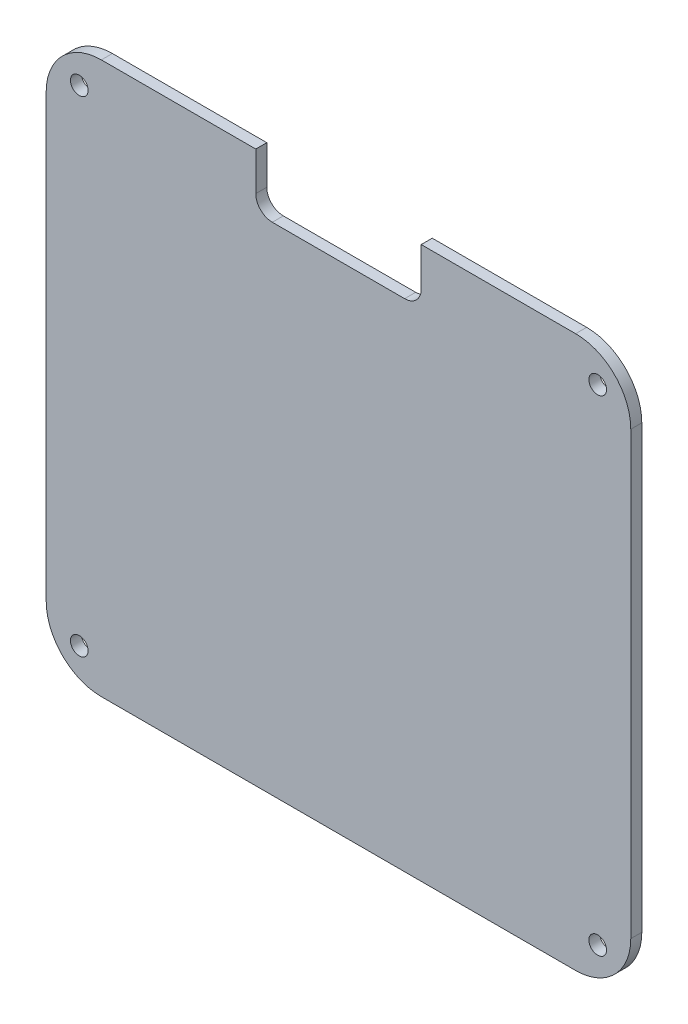
ISO-10303-21;
HEADER;
FILE_DESCRIPTION(('STEP AP214'),'2;1');
FILE_NAME('part.step','',(''),(''),'','','');
FILE_SCHEMA(('AUTOMOTIVE_DESIGN { 1 0 10303 214 1 1 1 1 }'));
ENDSEC;
DATA;
#1=APPLICATION_CONTEXT('core data for automotive mechanical design processes');
#2=APPLICATION_PROTOCOL_DEFINITION('international standard','automotive_design',2000,#1);
#3=PRODUCT_CONTEXT('',#1,'mechanical');
#4=PRODUCT('Part','Part','',(#3));
#5=PRODUCT_RELATED_PRODUCT_CATEGORY('part','',(#4));
#6=PRODUCT_DEFINITION_FORMATION('','',#4);
#7=PRODUCT_DEFINITION_CONTEXT('part definition',#1,'design');
#8=PRODUCT_DEFINITION('design','',#6,#7);
#9=PRODUCT_DEFINITION_SHAPE('','',#8);
#10=(LENGTH_UNIT() NAMED_UNIT(*) SI_UNIT(.MILLI.,.METRE.));
#11=(NAMED_UNIT(*) PLANE_ANGLE_UNIT() SI_UNIT($,.RADIAN.));
#12=(NAMED_UNIT(*) SI_UNIT($,.STERADIAN.) SOLID_ANGLE_UNIT());
#13=UNCERTAINTY_MEASURE_WITH_UNIT(LENGTH_MEASURE(1.E-05),#10,'distance_accuracy_value','');
#14=(GEOMETRIC_REPRESENTATION_CONTEXT(3) GLOBAL_UNCERTAINTY_ASSIGNED_CONTEXT((#13)) GLOBAL_UNIT_ASSIGNED_CONTEXT((#10,
#11,#12)) REPRESENTATION_CONTEXT('',''));
#15=CARTESIAN_POINT('',(0.,0.,0.));
#16=DIRECTION('',(0.,0.,1.));
#17=DIRECTION('',(1.,0.,0.));
#18=AXIS2_PLACEMENT_3D('',#15,#16,#17);
#19=CARTESIAN_POINT('',(43.,360.,-2.));
#20=DIRECTION('',(0.,1.,0.));
#21=DIRECTION('',(0.,0.,1.));
#22=AXIS2_PLACEMENT_3D('',#19,#20,#21);
#23=PLANE('',#22);
#24=DIRECTION('',(0.,0.,1.));
#25=VECTOR('',#24,1.);
#26=CARTESIAN_POINT('',(-15.0000000000001,360.,-2.));
#27=LINE('',#26,#25);
#28=CARTESIAN_POINT('',(-15.0000000000001,360.,-2.));
#29=VERTEX_POINT('',#28);
#30=CARTESIAN_POINT('',(-15.0000000000001,360.,0.));
#31=VERTEX_POINT('',#30);
#32=EDGE_CURVE('E150',#29,#31,#27,.T.);
#33=ORIENTED_EDGE('',*,*,#32,.F.);
#34=DIRECTION('',(-1.,0.,0.));
#35=VECTOR('',#34,1.);
#36=CARTESIAN_POINT('',(43.,360.,-2.));
#37=LINE('',#36,#35);
#38=CARTESIAN_POINT('',(-43.0000000000001,360.,-2.));
#39=VERTEX_POINT('',#38);
#40=EDGE_CURVE('E155',#29,#39,#37,.T.);
#41=ORIENTED_EDGE('',*,*,#40,.T.);
#42=DIRECTION('',(0.,0.,1.));
#43=VECTOR('',#42,1.);
#44=CARTESIAN_POINT('',(-43.0000000000001,360.,-2.));
#45=LINE('',#44,#43);
#46=CARTESIAN_POINT('',(-43.0000000000001,360.,0.));
#47=VERTEX_POINT('',#46);
#48=EDGE_CURVE('E197',#39,#47,#45,.T.);
#49=ORIENTED_EDGE('',*,*,#48,.T.);
#50=DIRECTION('',(-1.,0.,0.));
#51=VECTOR('',#50,1.);
#52=CARTESIAN_POINT('',(43.,360.,0.));
#53=LINE('',#52,#51);
#54=EDGE_CURVE('E182',#31,#47,#53,.T.);
#55=ORIENTED_EDGE('',*,*,#54,.F.);
#56=EDGE_LOOP('',(#33,#41,#49,#55));
#57=FACE_BOUND('',#56,.T.);
#58=ADVANCED_FACE('F33',(#57),#23,.T.);
#59=CARTESIAN_POINT('',(-43.0000000000001,270.,-2.));
#60=DIRECTION('',(0.,0.,1.));
#61=DIRECTION('',(1.,0.,0.));
#62=AXIS2_PLACEMENT_3D('',#59,#60,#61);
#63=CYLINDRICAL_SURFACE('',#62,10.);
#64=CARTESIAN_POINT('',(-43.0000000000001,270.,0.));
#65=DIRECTION('',(0.,0.,1.));
#66=DIRECTION('',(1.,0.,0.));
#67=AXIS2_PLACEMENT_3D('',#64,#65,#66);
#68=CIRCLE('',#67,10.);
#69=CARTESIAN_POINT('',(-53.0000000000001,270.,0.));
#70=VERTEX_POINT('',#69);
#71=CARTESIAN_POINT('',(-43.0000000000001,260.,0.));
#72=VERTEX_POINT('',#71);
#73=EDGE_CURVE('E167',#70,#72,#68,.T.);
#74=ORIENTED_EDGE('',*,*,#73,.F.);
#75=DIRECTION('',(0.,0.,1.));
#76=VECTOR('',#75,1.);
#77=CARTESIAN_POINT('',(-53.0000000000001,270.,-2.));
#78=LINE('',#77,#76);
#79=CARTESIAN_POINT('',(-53.0000000000001,270.,-2.));
#80=VERTEX_POINT('',#79);
#81=EDGE_CURVE('E192',#80,#70,#78,.T.);
#82=ORIENTED_EDGE('',*,*,#81,.F.);
#83=CARTESIAN_POINT('',(-43.0000000000001,270.,-2.));
#84=DIRECTION('',(0.,0.,1.));
#85=DIRECTION('',(1.,0.,0.));
#86=AXIS2_PLACEMENT_3D('',#83,#84,#85);
#87=CIRCLE('',#86,10.);
#88=CARTESIAN_POINT('',(-43.0000000000001,260.,-2.));
#89=VERTEX_POINT('',#88);
#90=EDGE_CURVE('E191',#80,#89,#87,.T.);
#91=ORIENTED_EDGE('',*,*,#90,.T.);
#92=DIRECTION('',(0.,0.,1.));
#93=VECTOR('',#92,1.);
#94=CARTESIAN_POINT('',(-43.0000000000001,260.,-2.));
#95=LINE('',#94,#93);
#96=EDGE_CURVE('E166',#89,#72,#95,.T.);
#97=ORIENTED_EDGE('',*,*,#96,.T.);
#98=EDGE_LOOP('',(#74,#82,#91,#97));
#99=FACE_BOUND('',#98,.T.);
#100=ADVANCED_FACE('F243',(#99),#63,.T.);
#101=CARTESIAN_POINT('',(-53.0000000000001,350.,-2.));
#102=DIRECTION('',(-1.,0.,0.));
#103=DIRECTION('',(0.,-1.,0.));
#104=AXIS2_PLACEMENT_3D('',#101,#102,#103);
#105=PLANE('',#104);
#106=DIRECTION('',(0.,-1.,0.));
#107=VECTOR('',#106,1.);
#108=CARTESIAN_POINT('',(-53.0000000000001,350.,0.));
#109=LINE('',#108,#107);
#110=CARTESIAN_POINT('',(-53.0000000000001,350.,0.));
#111=VERTEX_POINT('',#110);
#112=EDGE_CURVE('E188',#111,#70,#109,.T.);
#113=ORIENTED_EDGE('',*,*,#112,.F.);
#114=DIRECTION('',(0.,0.,1.));
#115=VECTOR('',#114,1.);
#116=CARTESIAN_POINT('',(-53.0000000000001,350.,-2.));
#117=LINE('',#116,#115);
#118=CARTESIAN_POINT('',(-53.0000000000001,350.,-2.));
#119=VERTEX_POINT('',#118);
#120=EDGE_CURVE('E195',#119,#111,#117,.T.);
#121=ORIENTED_EDGE('',*,*,#120,.F.);
#122=DIRECTION('',(0.,-1.,0.));
#123=VECTOR('',#122,1.);
#124=CARTESIAN_POINT('',(-53.0000000000001,350.,-2.));
#125=LINE('',#124,#123);
#126=EDGE_CURVE('E158',#119,#80,#125,.T.);
#127=ORIENTED_EDGE('',*,*,#126,.T.);
#128=ORIENTED_EDGE('',*,*,#81,.T.);
#129=EDGE_LOOP('',(#113,#121,#127,#128));
#130=FACE_BOUND('',#129,.T.);
#131=ADVANCED_FACE('F249',(#130),#105,.T.);
#132=CARTESIAN_POINT('',(-43.0000000000001,350.,-2.));
#133=DIRECTION('',(0.,0.,1.));
#134=DIRECTION('',(1.,0.,0.));
#135=AXIS2_PLACEMENT_3D('',#132,#133,#134);
#136=CYLINDRICAL_SURFACE('',#135,10.);
#137=CARTESIAN_POINT('',(-43.0000000000001,350.,0.));
#138=DIRECTION('',(0.,0.,1.));
#139=DIRECTION('',(1.,0.,0.));
#140=AXIS2_PLACEMENT_3D('',#137,#138,#139);
#141=CIRCLE('',#140,10.);
#142=EDGE_CURVE('E185',#47,#111,#141,.T.);
#143=ORIENTED_EDGE('',*,*,#142,.F.);
#144=ORIENTED_EDGE('',*,*,#48,.F.);
#145=CARTESIAN_POINT('',(-43.0000000000001,350.,-2.));
#146=DIRECTION('',(0.,0.,1.));
#147=DIRECTION('',(1.,0.,0.));
#148=AXIS2_PLACEMENT_3D('',#145,#146,#147);
#149=CIRCLE('',#148,10.);
#150=EDGE_CURVE('E154',#39,#119,#149,.T.);
#151=ORIENTED_EDGE('',*,*,#150,.T.);
#152=ORIENTED_EDGE('',*,*,#120,.T.);
#153=EDGE_LOOP('',(#143,#144,#151,#152));
#154=FACE_BOUND('',#153,.T.);
#155=ADVANCED_FACE('F257',(#154),#136,.T.);
#156=DIRECTION('',(0.,0.,1.));
#157=VECTOR('',#156,1.);
#158=CARTESIAN_POINT('',(14.9999999999999,360.,-2.));
#159=LINE('',#158,#157);
#160=CARTESIAN_POINT('',(14.9999999999999,360.,-2.));
#161=VERTEX_POINT('',#160);
#162=CARTESIAN_POINT('',(14.9999999999999,360.,0.));
#163=VERTEX_POINT('',#162);
#164=EDGE_CURVE('E140',#161,#163,#159,.T.);
#165=ORIENTED_EDGE('',*,*,#164,.T.);
#166=CARTESIAN_POINT('',(43.,360.,0.));
#167=VERTEX_POINT('',#166);
#168=EDGE_CURVE('E183',#167,#163,#53,.T.);
#169=ORIENTED_EDGE('',*,*,#168,.F.);
#170=DIRECTION('',(0.,0.,1.));
#171=VECTOR('',#170,1.);
#172=CARTESIAN_POINT('',(43.,360.,-2.));
#173=LINE('',#172,#171);
#174=CARTESIAN_POINT('',(43.,360.,-2.));
#175=VERTEX_POINT('',#174);
#176=EDGE_CURVE('E153',#175,#167,#173,.T.);
#177=ORIENTED_EDGE('',*,*,#176,.F.);
#178=EDGE_CURVE('E137',#175,#161,#37,.T.);
#179=ORIENTED_EDGE('',*,*,#178,.T.);
#180=EDGE_LOOP('',(#165,#169,#177,#179));
#181=FACE_BOUND('',#180,.T.);
#182=ADVANCED_FACE('F152',(#181),#23,.T.);
#183=CARTESIAN_POINT('',(43.,350.,-2.));
#184=DIRECTION('',(0.,0.,1.));
#185=DIRECTION('',(1.,0.,0.));
#186=AXIS2_PLACEMENT_3D('',#183,#184,#185);
#187=CYLINDRICAL_SURFACE('',#186,10.);
#188=CARTESIAN_POINT('',(43.,350.,0.));
#189=DIRECTION('',(0.,0.,1.));
#190=DIRECTION('',(1.,0.,0.));
#191=AXIS2_PLACEMENT_3D('',#188,#189,#190);
#192=CIRCLE('',#191,10.);
#193=CARTESIAN_POINT('',(53.,350.,0.));
#194=VERTEX_POINT('',#193);
#195=EDGE_CURVE('E179',#194,#167,#192,.T.);
#196=ORIENTED_EDGE('',*,*,#195,.F.);
#197=DIRECTION('',(0.,0.,1.));
#198=VECTOR('',#197,1.);
#199=CARTESIAN_POINT('',(53.,350.,-2.));
#200=LINE('',#199,#198);
#201=CARTESIAN_POINT('',(53.,350.,-2.));
#202=VERTEX_POINT('',#201);
#203=EDGE_CURVE('E201',#202,#194,#200,.T.);
#204=ORIENTED_EDGE('',*,*,#203,.F.);
#205=CARTESIAN_POINT('',(43.,350.,-2.));
#206=DIRECTION('',(0.,0.,1.));
#207=DIRECTION('',(1.,0.,0.));
#208=AXIS2_PLACEMENT_3D('',#205,#206,#207);
#209=CIRCLE('',#208,10.);
#210=EDGE_CURVE('E160',#202,#175,#209,.T.);
#211=ORIENTED_EDGE('',*,*,#210,.T.);
#212=ORIENTED_EDGE('',*,*,#176,.T.);
#213=EDGE_LOOP('',(#196,#204,#211,#212));
#214=FACE_BOUND('',#213,.T.);
#215=ADVANCED_FACE('F256',(#214),#187,.T.);
#216=CARTESIAN_POINT('',(53.,270.,-2.));
#217=DIRECTION('',(1.,0.,0.));
#218=DIRECTION('',(0.,1.,0.));
#219=AXIS2_PLACEMENT_3D('',#216,#217,#218);
#220=PLANE('',#219);
#221=DIRECTION('',(0.,1.,0.));
#222=VECTOR('',#221,1.);
#223=CARTESIAN_POINT('',(53.,270.,0.));
#224=LINE('',#223,#222);
#225=CARTESIAN_POINT('',(53.,270.,0.));
#226=VERTEX_POINT('',#225);
#227=EDGE_CURVE('E176',#226,#194,#224,.T.);
#228=ORIENTED_EDGE('',*,*,#227,.F.);
#229=DIRECTION('',(0.,0.,1.));
#230=VECTOR('',#229,1.);
#231=CARTESIAN_POINT('',(53.,270.,-2.));
#232=LINE('',#231,#230);
#233=CARTESIAN_POINT('',(53.,270.,-2.));
#234=VERTEX_POINT('',#233);
#235=EDGE_CURVE('E203',#234,#226,#232,.T.);
#236=ORIENTED_EDGE('',*,*,#235,.F.);
#237=DIRECTION('',(0.,1.,0.));
#238=VECTOR('',#237,1.);
#239=CARTESIAN_POINT('',(53.,270.,-2.));
#240=LINE('',#239,#238);
#241=EDGE_CURVE('E343',#234,#202,#240,.T.);
#242=ORIENTED_EDGE('',*,*,#241,.T.);
#243=ORIENTED_EDGE('',*,*,#203,.T.);
#244=EDGE_LOOP('',(#228,#236,#242,#243));
#245=FACE_BOUND('',#244,.T.);
#246=ADVANCED_FACE('F262',(#245),#220,.T.);
#247=CARTESIAN_POINT('',(43.,270.,-2.));
#248=DIRECTION('',(0.,0.,1.));
#249=DIRECTION('',(1.,0.,0.));
#250=AXIS2_PLACEMENT_3D('',#247,#248,#249);
#251=CYLINDRICAL_SURFACE('',#250,10.);
#252=CARTESIAN_POINT('',(43.,270.,0.));
#253=DIRECTION('',(0.,0.,1.));
#254=DIRECTION('',(1.,0.,0.));
#255=AXIS2_PLACEMENT_3D('',#252,#253,#254);
#256=CIRCLE('',#255,10.);
#257=CARTESIAN_POINT('',(43.,260.,0.));
#258=VERTEX_POINT('',#257);
#259=EDGE_CURVE('E173',#258,#226,#256,.T.);
#260=ORIENTED_EDGE('',*,*,#259,.F.);
#261=DIRECTION('',(0.,0.,1.));
#262=VECTOR('',#261,1.);
#263=CARTESIAN_POINT('',(43.,260.,-2.));
#264=LINE('',#263,#262);
#265=CARTESIAN_POINT('',(43.,260.,-2.));
#266=VERTEX_POINT('',#265);
#267=EDGE_CURVE('E205',#266,#258,#264,.T.);
#268=ORIENTED_EDGE('',*,*,#267,.F.);
#269=CARTESIAN_POINT('',(43.,270.,-2.));
#270=DIRECTION('',(0.,0.,1.));
#271=DIRECTION('',(1.,0.,0.));
#272=AXIS2_PLACEMENT_3D('',#269,#270,#271);
#273=CIRCLE('',#272,10.);
#274=EDGE_CURVE('E341',#266,#234,#273,.T.);
#275=ORIENTED_EDGE('',*,*,#274,.T.);
#276=ORIENTED_EDGE('',*,*,#235,.T.);
#277=EDGE_LOOP('',(#260,#268,#275,#276));
#278=FACE_BOUND('',#277,.T.);
#279=ADVANCED_FACE('F352',(#278),#251,.T.);
#280=CARTESIAN_POINT('',(-43.0000000000001,260.,-2.));
#281=DIRECTION('',(0.,-1.,0.));
#282=DIRECTION('',(0.,0.,-1.));
#283=AXIS2_PLACEMENT_3D('',#280,#281,#282);
#284=PLANE('',#283);
#285=DIRECTION('',(1.,0.,0.));
#286=VECTOR('',#285,1.);
#287=CARTESIAN_POINT('',(-43.0000000000001,260.,0.));
#288=LINE('',#287,#286);
#289=EDGE_CURVE('E170',#72,#258,#288,.T.);
#290=ORIENTED_EDGE('',*,*,#289,.F.);
#291=ORIENTED_EDGE('',*,*,#96,.F.);
#292=DIRECTION('',(1.,0.,0.));
#293=VECTOR('',#292,1.);
#294=CARTESIAN_POINT('',(-43.0000000000001,260.,-2.));
#295=LINE('',#294,#293);
#296=EDGE_CURVE('E338',#89,#266,#295,.T.);
#297=ORIENTED_EDGE('',*,*,#296,.T.);
#298=ORIENTED_EDGE('',*,*,#267,.T.);
#299=EDGE_LOOP('',(#290,#291,#297,#298));
#300=FACE_BOUND('',#299,.T.);
#301=ADVANCED_FACE('F278',(#300),#284,.T.);
#302=CARTESIAN_POINT('',(-43.0000000000001,270.,-2.));
#303=DIRECTION('',(0.,0.,1.));
#304=DIRECTION('',(1.,0.,0.));
#305=AXIS2_PLACEMENT_3D('',#302,#303,#304);
#306=PLANE('',#305);
#307=CARTESIAN_POINT('',(-47.0000000000002,354.,-2.));
#308=DIRECTION('',(0.,0.,1.));
#309=DIRECTION('',(-1.,0.,0.));
#310=AXIS2_PLACEMENT_3D('',#307,#308,#309);
#311=CIRCLE('',#310,1.6);
#312=CARTESIAN_POINT('',(-48.6000000000002,354.,-2.));
#313=VERTEX_POINT('',#312);
#314=EDGE_CURVE('E317',#313,#313,#311,.T.);
#315=ORIENTED_EDGE('',*,*,#314,.T.);
#316=EDGE_LOOP('',(#315));
#317=FACE_BOUND('',#316,.T.);
#318=CARTESIAN_POINT('',(-47.,266.,-2.));
#319=DIRECTION('',(0.,0.,1.));
#320=DIRECTION('',(-1.,0.,0.));
#321=AXIS2_PLACEMENT_3D('',#318,#319,#320);
#322=CIRCLE('',#321,1.6);
#323=CARTESIAN_POINT('',(-48.6,266.,-2.));
#324=VERTEX_POINT('',#323);
#325=EDGE_CURVE('E307',#324,#324,#322,.T.);
#326=ORIENTED_EDGE('',*,*,#325,.T.);
#327=EDGE_LOOP('',(#326));
#328=FACE_BOUND('',#327,.T.);
#329=CARTESIAN_POINT('',(47.,266.,-2.));
#330=DIRECTION('',(0.,0.,1.));
#331=DIRECTION('',(1.,0.,0.));
#332=AXIS2_PLACEMENT_3D('',#329,#330,#331);
#333=CIRCLE('',#332,1.6);
#334=CARTESIAN_POINT('',(48.6,266.,-2.));
#335=VERTEX_POINT('',#334);
#336=EDGE_CURVE('E302',#335,#335,#333,.T.);
#337=ORIENTED_EDGE('',*,*,#336,.T.);
#338=EDGE_LOOP('',(#337));
#339=FACE_BOUND('',#338,.T.);
#340=CARTESIAN_POINT('',(47.,354.,-2.));
#341=DIRECTION('',(0.,0.,1.));
#342=DIRECTION('',(1.,0.,0.));
#343=AXIS2_PLACEMENT_3D('',#340,#341,#342);
#344=CIRCLE('',#343,1.6);
#345=CARTESIAN_POINT('',(48.6,354.,-2.));
#346=VERTEX_POINT('',#345);
#347=EDGE_CURVE('E323',#346,#346,#344,.T.);
#348=ORIENTED_EDGE('',*,*,#347,.T.);
#349=EDGE_LOOP('',(#348));
#350=FACE_BOUND('',#349,.T.);
#351=ORIENTED_EDGE('',*,*,#40,.F.);
#352=DIRECTION('',(0.,-1.,0.));
#353=VECTOR('',#352,1.);
#354=CARTESIAN_POINT('',(-15.0000000000001,360.,-2.));
#355=LINE('',#354,#353);
#356=CARTESIAN_POINT('',(-15.0000000000001,353.,-2.));
#357=VERTEX_POINT('',#356);
#358=EDGE_CURVE('E328',#29,#357,#355,.T.);
#359=ORIENTED_EDGE('',*,*,#358,.T.);
#360=CARTESIAN_POINT('',(-12.0000000000001,353.,-2.));
#361=DIRECTION('',(0.,0.,1.));
#362=DIRECTION('',(1.,0.,0.));
#363=AXIS2_PLACEMENT_3D('',#360,#361,#362);
#364=CIRCLE('',#363,3.);
#365=CARTESIAN_POINT('',(-12.0000000000001,350.,-2.));
#366=VERTEX_POINT('',#365);
#367=EDGE_CURVE('E218',#357,#366,#364,.T.);
#368=ORIENTED_EDGE('',*,*,#367,.T.);
#369=DIRECTION('',(1.,0.,0.));
#370=VECTOR('',#369,1.);
#371=CARTESIAN_POINT('',(-15.0000000000001,350.,-2.));
#372=LINE('',#371,#370);
#373=CARTESIAN_POINT('',(11.9999999999999,350.,-2.));
#374=VERTEX_POINT('',#373);
#375=EDGE_CURVE('E141',#366,#374,#372,.T.);
#376=ORIENTED_EDGE('',*,*,#375,.T.);
#377=CARTESIAN_POINT('',(11.9999999999999,353.,-2.));
#378=DIRECTION('',(0.,0.,1.));
#379=DIRECTION('',(1.,0.,0.));
#380=AXIS2_PLACEMENT_3D('',#377,#378,#379);
#381=CIRCLE('',#380,3.);
#382=CARTESIAN_POINT('',(14.9999999999999,353.,-2.));
#383=VERTEX_POINT('',#382);
#384=EDGE_CURVE('E11',#374,#383,#381,.T.);
#385=ORIENTED_EDGE('',*,*,#384,.T.);
#386=DIRECTION('',(0.,1.,0.));
#387=VECTOR('',#386,1.);
#388=CARTESIAN_POINT('',(14.9999999999999,360.,-2.));
#389=LINE('',#388,#387);
#390=EDGE_CURVE('E131',#383,#161,#389,.T.);
#391=ORIENTED_EDGE('',*,*,#390,.T.);
#392=ORIENTED_EDGE('',*,*,#178,.F.);
#393=ORIENTED_EDGE('',*,*,#210,.F.);
#394=ORIENTED_EDGE('',*,*,#241,.F.);
#395=ORIENTED_EDGE('',*,*,#274,.F.);
#396=ORIENTED_EDGE('',*,*,#296,.F.);
#397=ORIENTED_EDGE('',*,*,#90,.F.);
#398=ORIENTED_EDGE('',*,*,#126,.F.);
#399=ORIENTED_EDGE('',*,*,#150,.F.);
#400=EDGE_LOOP('',(#351,#359,#368,#376,#385,#391,#392,#393,#394,#395,#396,#397,#398,#399));
#401=FACE_BOUND('',#400,.T.);
#402=ADVANCED_FACE('F134',(#317,#328,#339,#350,#401),#306,.F.);
#403=CARTESIAN_POINT('',(-43.0000000000001,270.,0.));
#404=DIRECTION('',(0.,0.,1.));
#405=DIRECTION('',(1.,0.,0.));
#406=AXIS2_PLACEMENT_3D('',#403,#404,#405);
#407=PLANE('',#406);
#408=CARTESIAN_POINT('',(-47.0000000000002,354.,0.));
#409=DIRECTION('',(0.,0.,1.));
#410=DIRECTION('',(-1.,0.,0.));
#411=AXIS2_PLACEMENT_3D('',#408,#409,#410);
#412=CIRCLE('',#411,1.6);
#413=CARTESIAN_POINT('',(-48.6000000000002,354.,0.));
#414=VERTEX_POINT('',#413);
#415=EDGE_CURVE('E320',#414,#414,#412,.T.);
#416=ORIENTED_EDGE('',*,*,#415,.F.);
#417=EDGE_LOOP('',(#416));
#418=FACE_BOUND('',#417,.T.);
#419=CARTESIAN_POINT('',(-47.,266.,0.));
#420=DIRECTION('',(0.,0.,1.));
#421=DIRECTION('',(-1.,0.,0.));
#422=AXIS2_PLACEMENT_3D('',#419,#420,#421);
#423=CIRCLE('',#422,1.6);
#424=CARTESIAN_POINT('',(-48.6,266.,0.));
#425=VERTEX_POINT('',#424);
#426=EDGE_CURVE('E312',#425,#425,#423,.T.);
#427=ORIENTED_EDGE('',*,*,#426,.F.);
#428=EDGE_LOOP('',(#427));
#429=FACE_BOUND('',#428,.T.);
#430=CARTESIAN_POINT('',(47.,266.,0.));
#431=DIRECTION('',(0.,0.,1.));
#432=DIRECTION('',(1.,0.,0.));
#433=AXIS2_PLACEMENT_3D('',#430,#431,#432);
#434=CIRCLE('',#433,1.6);
#435=CARTESIAN_POINT('',(48.6,266.,0.));
#436=VERTEX_POINT('',#435);
#437=EDGE_CURVE('E305',#436,#436,#434,.T.);
#438=ORIENTED_EDGE('',*,*,#437,.F.);
#439=EDGE_LOOP('',(#438));
#440=FACE_BOUND('',#439,.T.);
#441=CARTESIAN_POINT('',(47.,354.,0.));
#442=DIRECTION('',(0.,0.,1.));
#443=DIRECTION('',(1.,0.,0.));
#444=AXIS2_PLACEMENT_3D('',#441,#442,#443);
#445=CIRCLE('',#444,1.6);
#446=CARTESIAN_POINT('',(48.6,354.,0.));
#447=VERTEX_POINT('',#446);
#448=EDGE_CURVE('E309',#447,#447,#445,.T.);
#449=ORIENTED_EDGE('',*,*,#448,.F.);
#450=EDGE_LOOP('',(#449));
#451=FACE_BOUND('',#450,.T.);
#452=DIRECTION('',(0.,-1.,0.));
#453=VECTOR('',#452,1.);
#454=CARTESIAN_POINT('',(-15.0000000000001,360.,0.));
#455=LINE('',#454,#453);
#456=CARTESIAN_POINT('',(-15.0000000000001,353.,0.));
#457=VERTEX_POINT('',#456);
#458=EDGE_CURVE('E229',#31,#457,#455,.T.);
#459=ORIENTED_EDGE('',*,*,#458,.F.);
#460=ORIENTED_EDGE('',*,*,#54,.T.);
#461=ORIENTED_EDGE('',*,*,#142,.T.);
#462=ORIENTED_EDGE('',*,*,#112,.T.);
#463=ORIENTED_EDGE('',*,*,#73,.T.);
#464=ORIENTED_EDGE('',*,*,#289,.T.);
#465=ORIENTED_EDGE('',*,*,#259,.T.);
#466=ORIENTED_EDGE('',*,*,#227,.T.);
#467=ORIENTED_EDGE('',*,*,#195,.T.);
#468=ORIENTED_EDGE('',*,*,#168,.T.);
#469=DIRECTION('',(0.,1.,0.));
#470=VECTOR('',#469,1.);
#471=CARTESIAN_POINT('',(14.9999999999999,360.,0.));
#472=LINE('',#471,#470);
#473=CARTESIAN_POINT('',(14.9999999999999,353.,0.));
#474=VERTEX_POINT('',#473);
#475=EDGE_CURVE('E146',#474,#163,#472,.T.);
#476=ORIENTED_EDGE('',*,*,#475,.F.);
#477=CARTESIAN_POINT('',(11.9999999999999,353.,0.));
#478=DIRECTION('',(0.,0.,1.));
#479=DIRECTION('',(1.,0.,0.));
#480=AXIS2_PLACEMENT_3D('',#477,#478,#479);
#481=CIRCLE('',#480,3.);
#482=CARTESIAN_POINT('',(11.9999999999999,350.,0.));
#483=VERTEX_POINT('',#482);
#484=EDGE_CURVE('E41',#474,#483,#481,.F.);
#485=ORIENTED_EDGE('',*,*,#484,.T.);
#486=DIRECTION('',(1.,0.,0.));
#487=VECTOR('',#486,1.);
#488=CARTESIAN_POINT('',(-15.0000000000001,350.,0.));
#489=LINE('',#488,#487);
#490=CARTESIAN_POINT('',(-12.0000000000001,350.,0.));
#491=VERTEX_POINT('',#490);
#492=EDGE_CURVE('E224',#491,#483,#489,.T.);
#493=ORIENTED_EDGE('',*,*,#492,.F.);
#494=CARTESIAN_POINT('',(-12.0000000000001,353.,0.));
#495=DIRECTION('',(0.,0.,1.));
#496=DIRECTION('',(1.,0.,0.));
#497=AXIS2_PLACEMENT_3D('',#494,#495,#496);
#498=CIRCLE('',#497,3.);
#499=EDGE_CURVE('E216',#491,#457,#498,.F.);
#500=ORIENTED_EDGE('',*,*,#499,.T.);
#501=EDGE_LOOP('',(#459,#460,#461,#462,#463,#464,#465,#466,#467,#468,#476,#485,#493,#500));
#502=FACE_BOUND('',#501,.T.);
#503=ADVANCED_FACE('F223',(#418,#429,#440,#451,#502),#407,.T.);
#504=CARTESIAN_POINT('',(-15.0000000000001,360.,-2.));
#505=DIRECTION('',(-1.,0.,0.));
#506=DIRECTION('',(0.,-1.,0.));
#507=AXIS2_PLACEMENT_3D('',#504,#505,#506);
#508=PLANE('',#507);
#509=ORIENTED_EDGE('',*,*,#458,.T.);
#510=DIRECTION('',(0.,0.,1.));
#511=VECTOR('',#510,1.);
#512=CARTESIAN_POINT('',(-15.0000000000001,353.,-2.));
#513=LINE('',#512,#511);
#514=EDGE_CURVE('E212',#457,#357,#513,.F.);
#515=ORIENTED_EDGE('',*,*,#514,.T.);
#516=ORIENTED_EDGE('',*,*,#358,.F.);
#517=ORIENTED_EDGE('',*,*,#32,.T.);
#518=EDGE_LOOP('',(#509,#515,#516,#517));
#519=FACE_BOUND('',#518,.T.);
#520=ADVANCED_FACE('F274',(#519),#508,.F.);
#521=CARTESIAN_POINT('',(14.9999999999999,360.,-2.));
#522=DIRECTION('',(1.,0.,0.));
#523=DIRECTION('',(0.,1.,0.));
#524=AXIS2_PLACEMENT_3D('',#521,#522,#523);
#525=PLANE('',#524);
#526=ORIENTED_EDGE('',*,*,#390,.F.);
#527=DIRECTION('',(0.,0.,1.));
#528=VECTOR('',#527,1.);
#529=CARTESIAN_POINT('',(14.9999999999999,353.,0.));
#530=LINE('',#529,#528);
#531=EDGE_CURVE('E214',#383,#474,#530,.T.);
#532=ORIENTED_EDGE('',*,*,#531,.T.);
#533=ORIENTED_EDGE('',*,*,#475,.T.);
#534=ORIENTED_EDGE('',*,*,#164,.F.);
#535=EDGE_LOOP('',(#526,#532,#533,#534));
#536=FACE_BOUND('',#535,.T.);
#537=ADVANCED_FACE('F144',(#536),#525,.F.);
#538=CARTESIAN_POINT('',(-15.0000000000001,350.,-2.));
#539=DIRECTION('',(0.,-1.,0.));
#540=DIRECTION('',(0.,0.,-1.));
#541=AXIS2_PLACEMENT_3D('',#538,#539,#540);
#542=PLANE('',#541);
#543=ORIENTED_EDGE('',*,*,#375,.F.);
#544=DIRECTION('',(0.,0.,1.));
#545=VECTOR('',#544,1.);
#546=CARTESIAN_POINT('',(-12.0000000000001,350.,0.));
#547=LINE('',#546,#545);
#548=EDGE_CURVE('E209',#366,#491,#547,.T.);
#549=ORIENTED_EDGE('',*,*,#548,.T.);
#550=ORIENTED_EDGE('',*,*,#492,.T.);
#551=DIRECTION('',(0.,0.,1.));
#552=VECTOR('',#551,1.);
#553=CARTESIAN_POINT('',(11.9999999999999,350.,-2.));
#554=LINE('',#553,#552);
#555=EDGE_CURVE('E194',#483,#374,#554,.F.);
#556=ORIENTED_EDGE('',*,*,#555,.T.);
#557=EDGE_LOOP('',(#543,#549,#550,#556));
#558=FACE_BOUND('',#557,.T.);
#559=ADVANCED_FACE('F227',(#558),#542,.F.);
#560=CARTESIAN_POINT('',(-12.0000000000001,353.,-2.));
#561=DIRECTION('',(0.,0.,-1.));
#562=DIRECTION('',(-1.,0.,0.));
#563=AXIS2_PLACEMENT_3D('',#560,#561,#562);
#564=CYLINDRICAL_SURFACE('',#563,3.);
#565=ORIENTED_EDGE('',*,*,#367,.F.);
#566=ORIENTED_EDGE('',*,*,#514,.F.);
#567=ORIENTED_EDGE('',*,*,#499,.F.);
#568=ORIENTED_EDGE('',*,*,#548,.F.);
#569=EDGE_LOOP('',(#565,#566,#567,#568));
#570=FACE_BOUND('',#569,.T.);
#571=ADVANCED_FACE('F233',(#570),#564,.F.);
#572=CARTESIAN_POINT('',(11.9999999999999,353.,-2.));
#573=DIRECTION('',(0.,0.,-1.));
#574=DIRECTION('',(-1.,0.,0.));
#575=AXIS2_PLACEMENT_3D('',#572,#573,#574);
#576=CYLINDRICAL_SURFACE('',#575,3.);
#577=ORIENTED_EDGE('',*,*,#384,.F.);
#578=ORIENTED_EDGE('',*,*,#555,.F.);
#579=ORIENTED_EDGE('',*,*,#484,.F.);
#580=ORIENTED_EDGE('',*,*,#531,.F.);
#581=EDGE_LOOP('',(#577,#578,#579,#580));
#582=FACE_BOUND('',#581,.T.);
#583=ADVANCED_FACE('F35',(#582),#576,.F.);
#584=CARTESIAN_POINT('',(47.,354.,-2.));
#585=DIRECTION('',(0.,0.,1.));
#586=DIRECTION('',(1.,0.,0.));
#587=AXIS2_PLACEMENT_3D('',#584,#585,#586);
#588=CYLINDRICAL_SURFACE('',#587,1.6);
#589=ORIENTED_EDGE('',*,*,#347,.F.);
#590=EDGE_LOOP('',(#589));
#591=FACE_BOUND('',#590,.T.);
#592=ORIENTED_EDGE('',*,*,#448,.T.);
#593=EDGE_LOOP('',(#592));
#594=FACE_BOUND('',#593,.T.);
#595=ADVANCED_FACE('F232',(#591,#594),#588,.F.);
#596=CARTESIAN_POINT('',(47.,266.,-2.));
#597=DIRECTION('',(0.,0.,1.));
#598=DIRECTION('',(1.,0.,0.));
#599=AXIS2_PLACEMENT_3D('',#596,#597,#598);
#600=CYLINDRICAL_SURFACE('',#599,1.6);
#601=ORIENTED_EDGE('',*,*,#336,.F.);
#602=EDGE_LOOP('',(#601));
#603=FACE_BOUND('',#602,.T.);
#604=ORIENTED_EDGE('',*,*,#437,.T.);
#605=EDGE_LOOP('',(#604));
#606=FACE_BOUND('',#605,.T.);
#607=ADVANCED_FACE('F238',(#603,#606),#600,.F.);
#608=CARTESIAN_POINT('',(-47.,266.,-2.));
#609=DIRECTION('',(0.,0.,1.));
#610=DIRECTION('',(1.,0.,0.));
#611=AXIS2_PLACEMENT_3D('',#608,#609,#610);
#612=CYLINDRICAL_SURFACE('',#611,1.6);
#613=ORIENTED_EDGE('',*,*,#325,.F.);
#614=EDGE_LOOP('',(#613));
#615=FACE_BOUND('',#614,.T.);
#616=ORIENTED_EDGE('',*,*,#426,.T.);
#617=EDGE_LOOP('',(#616));
#618=FACE_BOUND('',#617,.T.);
#619=ADVANCED_FACE('F290',(#615,#618),#612,.F.);
#620=CARTESIAN_POINT('',(-47.0000000000002,354.,-2.));
#621=DIRECTION('',(0.,0.,1.));
#622=DIRECTION('',(1.,0.,0.));
#623=AXIS2_PLACEMENT_3D('',#620,#621,#622);
#624=CYLINDRICAL_SURFACE('',#623,1.6);
#625=ORIENTED_EDGE('',*,*,#314,.F.);
#626=EDGE_LOOP('',(#625));
#627=FACE_BOUND('',#626,.T.);
#628=ORIENTED_EDGE('',*,*,#415,.T.);
#629=EDGE_LOOP('',(#628));
#630=FACE_BOUND('',#629,.T.);
#631=ADVANCED_FACE('F287',(#627,#630),#624,.F.);
#632=CLOSED_SHELL('',(#58,#100,#131,#155,#182,#215,#246,#279,#301,#402,#503,#520,#537,#559,#571,
#583,#595,#607,#619,#631));
#633=MANIFOLD_SOLID_BREP('B2',#632);
#634=ADVANCED_BREP_SHAPE_REPRESENTATION('',(#18,#633),#14);
#635=SHAPE_DEFINITION_REPRESENTATION(#9,#634);
ENDSEC;
END-ISO-10303-21;
